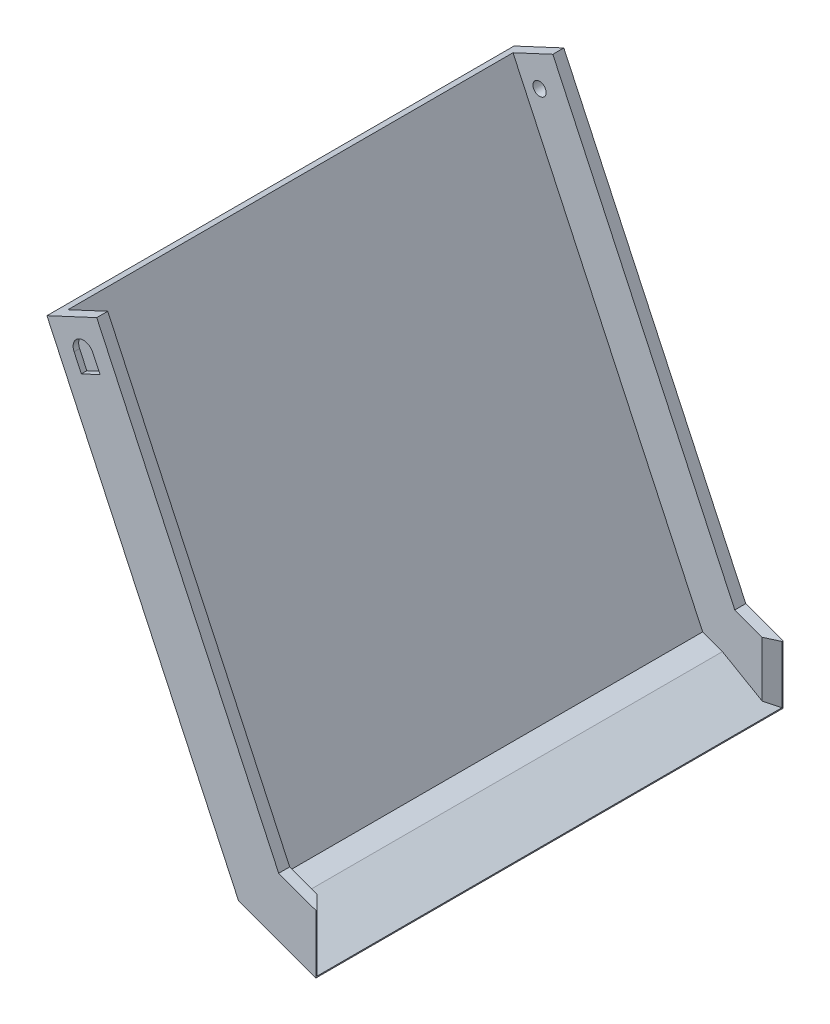
ISO-10303-21;
HEADER;
FILE_DESCRIPTION(('STEP AP214'),'2;1');
FILE_NAME('part.step','',(''),(''),'','','');
FILE_SCHEMA(('AUTOMOTIVE_DESIGN { 1 0 10303 214 1 1 1 1 }'));
ENDSEC;
DATA;
#1=APPLICATION_CONTEXT('core data for automotive mechanical design processes');
#2=APPLICATION_PROTOCOL_DEFINITION('international standard','automotive_design',2000,#1);
#3=PRODUCT_CONTEXT('',#1,'mechanical');
#4=PRODUCT('Part','Part','',(#3));
#5=PRODUCT_RELATED_PRODUCT_CATEGORY('part','',(#4));
#6=PRODUCT_DEFINITION_FORMATION('','',#4);
#7=PRODUCT_DEFINITION_CONTEXT('part definition',#1,'design');
#8=PRODUCT_DEFINITION('design','',#6,#7);
#9=PRODUCT_DEFINITION_SHAPE('','',#8);
#10=(LENGTH_UNIT() NAMED_UNIT(*) SI_UNIT(.MILLI.,.METRE.));
#11=(NAMED_UNIT(*) PLANE_ANGLE_UNIT() SI_UNIT($,.RADIAN.));
#12=(NAMED_UNIT(*) SI_UNIT($,.STERADIAN.) SOLID_ANGLE_UNIT());
#13=UNCERTAINTY_MEASURE_WITH_UNIT(LENGTH_MEASURE(1.E-05),#10,'distance_accuracy_value','');
#14=(GEOMETRIC_REPRESENTATION_CONTEXT(3) GLOBAL_UNCERTAINTY_ASSIGNED_CONTEXT((#13)) GLOBAL_UNIT_ASSIGNED_CONTEXT((#10,
#11,#12)) REPRESENTATION_CONTEXT('',''));
#15=CARTESIAN_POINT('',(0.,0.,0.));
#16=DIRECTION('',(0.,0.,1.));
#17=DIRECTION('',(1.,0.,0.));
#18=AXIS2_PLACEMENT_3D('',#15,#16,#17);
#19=CARTESIAN_POINT('',(0.,0.,170.));
#20=DIRECTION('',(1.,0.,0.));
#21=DIRECTION('',(0.,1.,0.));
#22=AXIS2_PLACEMENT_3D('',#19,#20,#21);
#23=PLANE('',#22);
#24=DIRECTION('',(0.,0.,-1.));
#25=VECTOR('',#24,1.);
#26=CARTESIAN_POINT('',(0.,-20.8835554495183,188.550403328736));
#27=LINE('',#26,#25);
#28=CARTESIAN_POINT('',(0.,-20.8835554495183,169.6));
#29=VERTEX_POINT('',#28);
#30=CARTESIAN_POINT('',(0.,-20.8835554495183,0.399999999999984));
#31=VERTEX_POINT('',#30);
#32=EDGE_CURVE('E179',#29,#31,#27,.T.);
#33=ORIENTED_EDGE('',*,*,#32,.F.);
#34=DIRECTION('',(0.,1.,0.));
#35=VECTOR('',#34,1.);
#36=CARTESIAN_POINT('',(0.,0.,169.6));
#37=LINE('',#36,#35);
#38=CARTESIAN_POINT('',(0.,0.,169.6));
#39=VERTEX_POINT('',#38);
#40=EDGE_CURVE('E281',#29,#39,#37,.T.);
#41=ORIENTED_EDGE('',*,*,#40,.T.);
#42=DIRECTION('',(0.,0.,-1.));
#43=VECTOR('',#42,1.);
#44=CARTESIAN_POINT('',(0.,0.,170.));
#45=LINE('',#44,#43);
#46=CARTESIAN_POINT('',(0.,0.,170.));
#47=VERTEX_POINT('',#46);
#48=EDGE_CURVE('E265',#47,#39,#45,.T.);
#49=ORIENTED_EDGE('',*,*,#48,.F.);
#50=DIRECTION('',(0.,-1.,0.));
#51=VECTOR('',#50,1.);
#52=CARTESIAN_POINT('',(0.,0.,170.));
#53=LINE('',#52,#51);
#54=CARTESIAN_POINT('',(0.,-21.2835554495183,170.));
#55=VERTEX_POINT('',#54);
#56=EDGE_CURVE('E232',#47,#55,#53,.T.);
#57=ORIENTED_EDGE('',*,*,#56,.T.);
#58=DIRECTION('',(0.,0.,-1.));
#59=VECTOR('',#58,1.);
#60=CARTESIAN_POINT('',(0.,-21.2835554495183,170.));
#61=LINE('',#60,#59);
#62=CARTESIAN_POINT('',(0.,-21.2835554495183,0.));
#63=VERTEX_POINT('',#62);
#64=EDGE_CURVE('E263',#55,#63,#61,.T.);
#65=ORIENTED_EDGE('',*,*,#64,.T.);
#66=DIRECTION('',(0.,-1.,0.));
#67=VECTOR('',#66,1.);
#68=CARTESIAN_POINT('',(0.,0.,0.));
#69=LINE('',#68,#67);
#70=CARTESIAN_POINT('',(0.,0.,0.));
#71=VERTEX_POINT('',#70);
#72=EDGE_CURVE('E250',#71,#63,#69,.T.);
#73=ORIENTED_EDGE('',*,*,#72,.F.);
#74=CARTESIAN_POINT('',(0.,0.,0.399999999999984));
#75=VERTEX_POINT('',#74);
#76=EDGE_CURVE('E268',#75,#71,#45,.T.);
#77=ORIENTED_EDGE('',*,*,#76,.F.);
#78=DIRECTION('',(0.,-1.,0.));
#79=VECTOR('',#78,1.);
#80=CARTESIAN_POINT('',(0.,-20.8835554495183,0.399999999999984));
#81=LINE('',#80,#79);
#82=EDGE_CURVE('E278',#75,#31,#81,.T.);
#83=ORIENTED_EDGE('',*,*,#82,.T.);
#84=EDGE_LOOP('',(#33,#41,#49,#57,#65,#73,#77,#83));
#85=FACE_BOUND('',#84,.T.);
#86=ADVANCED_FACE('F43',(#85),#23,.T.);
#87=CARTESIAN_POINT('',(1.36808057330269,-17.5247849663746,170.));
#88=DIRECTION('',(-0.342020143325673,-0.939692620785907,0.));
#89=DIRECTION('',(0.939692620785907,-0.342020143325673,0.));
#90=AXIS2_PLACEMENT_3D('',#87,#88,#89);
#91=PLANE('',#90);
#92=DIRECTION('',(0.,0.,1.));
#93=VECTOR('',#92,1.);
#94=CARTESIAN_POINT('',(-18.0743765052232,-10.4483093087929,170.));
#95=LINE('',#94,#93);
#96=CARTESIAN_POINT('',(-18.0743765052232,-10.4483093087929,4.));
#97=VERTEX_POINT('',#96);
#98=CARTESIAN_POINT('',(-18.0743765052232,-10.4483093087929,166.));
#99=VERTEX_POINT('',#98);
#100=EDGE_CURVE('E176',#97,#99,#95,.T.);
#101=ORIENTED_EDGE('',*,*,#100,.F.);
#102=DIRECTION('',(-0.939692620785907,0.342020143325673,0.));
#103=VECTOR('',#102,1.);
#104=CARTESIAN_POINT('',(-5.47232229321076,-15.0350819325745,4.));
#105=LINE('',#104,#103);
#106=CARTESIAN_POINT('',(-25.2657643383088,-7.8308581944856,4.));
#107=VERTEX_POINT('',#106);
#108=EDGE_CURVE('E184',#97,#107,#105,.T.);
#109=ORIENTED_EDGE('',*,*,#108,.T.);
#110=DIRECTION('',(0.,0.,-1.));
#111=VECTOR('',#110,1.);
#112=CARTESIAN_POINT('',(-25.2657643383087,-7.83085819448561,170.));
#113=LINE('',#112,#111);
#114=CARTESIAN_POINT('',(-25.2657643383088,-7.8308581944856,166.));
#115=VERTEX_POINT('',#114);
#116=EDGE_CURVE('E210',#115,#107,#113,.T.);
#117=ORIENTED_EDGE('',*,*,#116,.F.);
#118=DIRECTION('',(-0.939692620785907,0.342020143325673,0.));
#119=VECTOR('',#118,1.);
#120=CARTESIAN_POINT('',(-5.47232229321076,-15.0350819325745,166.));
#121=LINE('',#120,#119);
#122=EDGE_CURVE('E186',#99,#115,#121,.T.);
#123=ORIENTED_EDGE('',*,*,#122,.F.);
#124=EDGE_LOOP('',(#101,#109,#117,#123));
#125=FACE_BOUND('',#124,.T.);
#126=ADVANCED_FACE('F182',(#125),#91,.F.);
#127=CARTESIAN_POINT('',(0.,0.,170.));
#128=DIRECTION('',(0.,0.,-1.));
#129=DIRECTION('',(-1.,0.,0.));
#130=AXIS2_PLACEMENT_3D('',#127,#128,#129);
#131=PLANE('',#130);
#132=DIRECTION('',(0.906307787036652,0.422618261740695,0.));
#133=VECTOR('',#132,1.);
#134=CARTESIAN_POINT('',(-97.9227918107918,138.5178337113,170.));
#135=LINE('',#134,#133);
#136=CARTESIAN_POINT('',(-97.9227918107918,138.5178337113,170.));
#137=VERTEX_POINT('',#136);
#138=CARTESIAN_POINT('',(-79.7966360700587,146.970198946113,170.));
#139=VERTEX_POINT('',#138);
#140=EDGE_CURVE('E222',#137,#139,#135,.T.);
#141=ORIENTED_EDGE('',*,*,#140,.F.);
#142=DIRECTION('',(-0.422618261740694,0.906307787036652,0.));
#143=VECTOR('',#142,1.);
#144=CARTESIAN_POINT('',(-28.1907786235772,-11.0229511497481,170.));
#145=LINE('',#144,#143);
#146=CARTESIAN_POINT('',(-28.1907786235772,-11.0229511497481,170.));
#147=VERTEX_POINT('',#146);
#148=EDGE_CURVE('E238',#147,#137,#145,.T.);
#149=ORIENTED_EDGE('',*,*,#148,.F.);
#150=DIRECTION('',(-0.939692620785907,0.342020143325673,0.));
#151=VECTOR('',#150,1.);
#152=CARTESIAN_POINT('',(0.,-21.2835554495183,170.));
#153=LINE('',#152,#151);
#154=EDGE_CURVE('E235',#55,#147,#153,.T.);
#155=ORIENTED_EDGE('',*,*,#154,.F.);
#156=ORIENTED_EDGE('',*,*,#56,.F.);
#157=DIRECTION('',(0.939692620785907,-0.342020143325672,0.));
#158=VECTOR('',#157,1.);
#159=CARTESIAN_POINT('',(-13.5657071972349,4.93751362656435,170.));
#160=LINE('',#159,#158);
#161=CARTESIAN_POINT('',(-13.5657071972349,4.93751362656435,170.));
#162=VERTEX_POINT('',#161);
#163=EDGE_CURVE('E229',#162,#47,#160,.T.);
#164=ORIENTED_EDGE('',*,*,#163,.F.);
#165=DIRECTION('',(0.422618261740694,-0.906307787036652,0.));
#166=VECTOR('',#165,1.);
#167=CARTESIAN_POINT('',(-79.7966360700587,146.970198946113,170.));
#168=LINE('',#167,#166);
#169=EDGE_CURVE('E225',#139,#162,#168,.T.);
#170=ORIENTED_EDGE('',*,*,#169,.F.);
#171=EDGE_LOOP('',(#141,#149,#155,#156,#164,#170));
#172=FACE_BOUND('',#171,.T.);
#173=DIRECTION('',(0.42261826174069,-0.906307787036654,0.));
#174=VECTOR('',#173,1.);
#175=CARTESIAN_POINT('',(-81.2348771216308,135.265756939868,170.));
#176=LINE('',#175,#174);
#177=CARTESIAN_POINT('',(-81.2348771216308,135.265756939868,170.));
#178=VERTEX_POINT('',#177);
#179=CARTESIAN_POINT('',(-78.5935129857515,129.601333270889,170.));
#180=VERTEX_POINT('',#179);
#181=EDGE_CURVE('E187',#178,#180,#176,.T.);
#182=ORIENTED_EDGE('',*,*,#181,.T.);
#183=DIRECTION('',(-0.906307787036652,-0.422618261740694,0.));
#184=VECTOR('',#183,1.);
#185=CARTESIAN_POINT('',(-78.5935129857515,129.601333270889,170.));
#186=LINE('',#185,#184);
#187=CARTESIAN_POINT('',(-85.3908213885264,126.431696307833,170.));
#188=VERTEX_POINT('',#187);
#189=EDGE_CURVE('E403',#180,#188,#186,.T.);
#190=ORIENTED_EDGE('',*,*,#189,.T.);
#191=DIRECTION('',(-0.422618261740697,0.906307787036651,0.));
#192=VECTOR('',#191,1.);
#193=CARTESIAN_POINT('',(-85.3908213885264,126.431696307833,170.));
#194=LINE('',#193,#192);
#195=CARTESIAN_POINT('',(-88.0321855244058,132.096119976812,170.));
#196=VERTEX_POINT('',#195);
#197=EDGE_CURVE('E400',#188,#196,#194,.T.);
#198=ORIENTED_EDGE('',*,*,#197,.T.);
#199=CARTESIAN_POINT('',(-84.6335313230183,133.68093845834,170.));
#200=DIRECTION('',(0.,0.,1.));
#201=DIRECTION('',(1.,0.,0.));
#202=AXIS2_PLACEMENT_3D('',#199,#200,#201);
#203=CIRCLE('',#202,3.75000000000004);
#204=EDGE_CURVE('E396',#178,#196,#203,.T.);
#205=ORIENTED_EDGE('',*,*,#204,.F.);
#206=EDGE_LOOP('',(#182,#190,#198,#205));
#207=FACE_BOUND('',#206,.T.);
#208=ADVANCED_FACE('F303',(#172,#207),#131,.F.);
#209=CARTESIAN_POINT('',(-97.9227918107918,138.5178337113,170.));
#210=DIRECTION('',(-0.422618261740695,0.906307787036652,0.));
#211=DIRECTION('',(-0.906307787036652,-0.422618261740695,0.));
#212=AXIS2_PLACEMENT_3D('',#209,#210,#211);
#213=PLANE('',#212);
#214=DIRECTION('',(0.,0.,-1.));
#215=VECTOR('',#214,1.);
#216=CARTESIAN_POINT('',(-94.2975606626452,140.208306758262,170.));
#217=LINE('',#216,#215);
#218=CARTESIAN_POINT('',(-94.2975606626452,140.208306758262,166.));
#219=VERTEX_POINT('',#218);
#220=CARTESIAN_POINT('',(-94.2975606626452,140.208306758262,4.));
#221=VERTEX_POINT('',#220);
#222=EDGE_CURVE('E206',#219,#221,#217,.T.);
#223=ORIENTED_EDGE('',*,*,#222,.T.);
#224=DIRECTION('',(0.906307787036652,0.422618261740695,0.));
#225=VECTOR('',#224,1.);
#226=CARTESIAN_POINT('',(-70.5450256581592,151.284295731449,4.));
#227=LINE('',#226,#225);
#228=CARTESIAN_POINT('',(-79.7966360700587,146.970198946113,4.));
#229=VERTEX_POINT('',#228);
#230=EDGE_CURVE('E218',#221,#229,#227,.T.);
#231=ORIENTED_EDGE('',*,*,#230,.T.);
#232=DIRECTION('',(0.,0.,-1.));
#233=VECTOR('',#232,1.);
#234=CARTESIAN_POINT('',(-79.7966360700587,146.970198946113,170.));
#235=LINE('',#234,#233);
#236=CARTESIAN_POINT('',(-79.7966360700587,146.970198946113,0.));
#237=VERTEX_POINT('',#236);
#238=EDGE_CURVE('E241',#229,#237,#235,.T.);
#239=ORIENTED_EDGE('',*,*,#238,.T.);
#240=DIRECTION('',(0.906307787036652,0.422618261740695,0.));
#241=VECTOR('',#240,1.);
#242=CARTESIAN_POINT('',(-97.9227918107918,138.5178337113,0.));
#243=LINE('',#242,#241);
#244=CARTESIAN_POINT('',(-97.9227918107918,138.5178337113,0.));
#245=VERTEX_POINT('',#244);
#246=EDGE_CURVE('E209',#245,#237,#243,.T.);
#247=ORIENTED_EDGE('',*,*,#246,.F.);
#248=DIRECTION('',(0.,0.,-1.));
#249=VECTOR('',#248,1.);
#250=CARTESIAN_POINT('',(-97.9227918107918,138.5178337113,170.));
#251=LINE('',#250,#249);
#252=EDGE_CURVE('E258',#137,#245,#251,.T.);
#253=ORIENTED_EDGE('',*,*,#252,.F.);
#254=ORIENTED_EDGE('',*,*,#140,.T.);
#255=CARTESIAN_POINT('',(-79.7966360700587,146.970198946113,166.));
#256=VERTEX_POINT('',#255);
#257=EDGE_CURVE('E273',#139,#256,#235,.T.);
#258=ORIENTED_EDGE('',*,*,#257,.T.);
#259=DIRECTION('',(0.906307787036652,0.422618261740695,0.));
#260=VECTOR('',#259,1.);
#261=CARTESIAN_POINT('',(-70.5450256581592,151.284295731449,166.));
#262=LINE('',#261,#260);
#263=EDGE_CURVE('E196',#219,#256,#262,.T.);
#264=ORIENTED_EDGE('',*,*,#263,.F.);
#265=EDGE_LOOP('',(#223,#231,#239,#247,#253,#254,#258,#264));
#266=FACE_BOUND('',#265,.T.);
#267=ADVANCED_FACE('F311',(#266),#213,.T.);
#268=CARTESIAN_POINT('',(-13.5657071972349,4.93751362656435,170.));
#269=DIRECTION('',(0.342020143325672,0.939692620785907,0.));
#270=DIRECTION('',(-0.939692620785907,0.342020143325672,0.));
#271=AXIS2_PLACEMENT_3D('',#268,#269,#270);
#272=PLANE('',#271);
#273=DIRECTION('',(0.939692620785907,-0.342020143325672,0.));
#274=VECTOR('',#273,1.);
#275=CARTESIAN_POINT('',(0.,0.,4.));
#276=LINE('',#275,#274);
#277=CARTESIAN_POINT('',(-13.5657071972349,4.93751362656435,4.));
#278=VERTEX_POINT('',#277);
#279=CARTESIAN_POINT('',(-3.60000000000002,1.31029284335835,4.));
#280=VERTEX_POINT('',#279);
#281=EDGE_CURVE('E194',#278,#280,#276,.T.);
#282=ORIENTED_EDGE('',*,*,#281,.T.);
#283=DIRECTION('',(0.684791078771736,-0.249243569363957,-0.684791078771735));
#284=VECTOR('',#283,1.);
#285=CARTESIAN_POINT('',(-86.7362445879475,31.5694112620463,87.1362445879474));
#286=LINE('',#285,#284);
#287=EDGE_CURVE('E286',#280,#75,#286,.T.);
#288=ORIENTED_EDGE('',*,*,#287,.T.);
#289=ORIENTED_EDGE('',*,*,#76,.T.);
#290=DIRECTION('',(0.939692620785907,-0.342020143325672,0.));
#291=VECTOR('',#290,1.);
#292=CARTESIAN_POINT('',(-13.5657071972349,4.93751362656435,0.));
#293=LINE('',#292,#291);
#294=CARTESIAN_POINT('',(-13.5657071972349,4.93751362656435,0.));
#295=VERTEX_POINT('',#294);
#296=EDGE_CURVE('E247',#295,#71,#293,.T.);
#297=ORIENTED_EDGE('',*,*,#296,.F.);
#298=DIRECTION('',(0.,0.,-1.));
#299=VECTOR('',#298,1.);
#300=CARTESIAN_POINT('',(-13.5657071972349,4.93751362656435,170.));
#301=LINE('',#300,#299);
#302=EDGE_CURVE('E272',#278,#295,#301,.T.);
#303=ORIENTED_EDGE('',*,*,#302,.F.);
#304=EDGE_LOOP('',(#282,#288,#289,#297,#303));
#305=FACE_BOUND('',#304,.T.);
#306=ADVANCED_FACE('F328',(#305),#272,.T.);
#307=CARTESIAN_POINT('',(-79.7966360700587,146.970198946113,170.));
#308=DIRECTION('',(0.906307787036652,0.422618261740694,0.));
#309=DIRECTION('',(-0.422618261740695,0.906307787036652,0.));
#310=AXIS2_PLACEMENT_3D('',#307,#308,#309);
#311=PLANE('',#310);
#312=ORIENTED_EDGE('',*,*,#238,.F.);
#313=DIRECTION('',(0.422618261740695,-0.906307787036652,0.));
#314=VECTOR('',#313,1.);
#315=CARTESIAN_POINT('',(-9.25161041189965,-4.31409678533526,4.));
#316=LINE('',#315,#314);
#317=EDGE_CURVE('E198',#229,#278,#316,.T.);
#318=ORIENTED_EDGE('',*,*,#317,.T.);
#319=ORIENTED_EDGE('',*,*,#302,.T.);
#320=DIRECTION('',(0.422618261740694,-0.906307787036652,0.));
#321=VECTOR('',#320,1.);
#322=CARTESIAN_POINT('',(-79.7966360700587,146.970198946113,0.));
#323=LINE('',#322,#321);
#324=EDGE_CURVE('E244',#237,#295,#323,.T.);
#325=ORIENTED_EDGE('',*,*,#324,.F.);
#326=EDGE_LOOP('',(#312,#318,#319,#325));
#327=FACE_BOUND('',#326,.T.);
#328=ADVANCED_FACE('F353',(#327),#311,.T.);
#329=CARTESIAN_POINT('',(-28.1907786235772,-11.0229511497481,170.));
#330=DIRECTION('',(-0.906307787036652,-0.422618261740694,0.));
#331=DIRECTION('',(0.422618261740694,-0.906307787036652,0.));
#332=AXIS2_PLACEMENT_3D('',#329,#330,#331);
#333=PLANE('',#332);
#334=DIRECTION('',(-0.422618261740694,0.906307787036652,0.));
#335=VECTOR('',#334,1.);
#336=CARTESIAN_POINT('',(-28.1907786235772,-11.0229511497481,0.));
#337=LINE('',#336,#335);
#338=CARTESIAN_POINT('',(-28.1907786235772,-11.0229511497481,0.));
#339=VERTEX_POINT('',#338);
#340=EDGE_CURVE('E226',#339,#245,#337,.T.);
#341=ORIENTED_EDGE('',*,*,#340,.F.);
#342=DIRECTION('',(0.,0.,-1.));
#343=VECTOR('',#342,1.);
#344=CARTESIAN_POINT('',(-28.1907786235772,-11.0229511497481,170.));
#345=LINE('',#344,#343);
#346=EDGE_CURVE('E261',#147,#339,#345,.T.);
#347=ORIENTED_EDGE('',*,*,#346,.F.);
#348=ORIENTED_EDGE('',*,*,#148,.T.);
#349=ORIENTED_EDGE('',*,*,#252,.T.);
#350=EDGE_LOOP('',(#341,#347,#348,#349));
#351=FACE_BOUND('',#350,.T.);
#352=ADVANCED_FACE('F316',(#351),#333,.T.);
#353=CARTESIAN_POINT('',(0.,-21.2835554495183,170.));
#354=DIRECTION('',(-0.342020143325673,-0.939692620785907,0.));
#355=DIRECTION('',(0.939692620785907,-0.342020143325673,0.));
#356=AXIS2_PLACEMENT_3D('',#353,#354,#355);
#357=PLANE('',#356);
#358=DIRECTION('',(-0.939692620785907,0.342020143325673,0.));
#359=VECTOR('',#358,1.);
#360=CARTESIAN_POINT('',(0.,-21.2835554495183,0.));
#361=LINE('',#360,#359);
#362=EDGE_CURVE('E253',#63,#339,#361,.T.);
#363=ORIENTED_EDGE('',*,*,#362,.F.);
#364=ORIENTED_EDGE('',*,*,#64,.F.);
#365=ORIENTED_EDGE('',*,*,#154,.T.);
#366=ORIENTED_EDGE('',*,*,#346,.T.);
#367=EDGE_LOOP('',(#363,#364,#365,#366));
#368=FACE_BOUND('',#367,.T.);
#369=ADVANCED_FACE('F319',(#368),#357,.T.);
#370=ORIENTED_EDGE('',*,*,#48,.T.);
#371=DIRECTION('',(0.684791078771733,-0.249243569363956,0.684791078771738));
#372=VECTOR('',#371,1.);
#373=CARTESIAN_POINT('',(-7.01664492183669,2.55384989596369,162.583355078163));
#374=LINE('',#373,#372);
#375=CARTESIAN_POINT('',(-3.59999999999999,1.31029284335834,166.));
#376=VERTEX_POINT('',#375);
#377=EDGE_CURVE('E283',#39,#376,#374,.F.);
#378=ORIENTED_EDGE('',*,*,#377,.T.);
#379=DIRECTION('',(0.939692620785907,-0.342020143325672,0.));
#380=VECTOR('',#379,1.);
#381=CARTESIAN_POINT('',(0.,0.,166.));
#382=LINE('',#381,#380);
#383=CARTESIAN_POINT('',(-13.5657071972349,4.93751362656435,166.));
#384=VERTEX_POINT('',#383);
#385=EDGE_CURVE('E205',#384,#376,#382,.T.);
#386=ORIENTED_EDGE('',*,*,#385,.F.);
#387=EDGE_CURVE('E269',#162,#384,#301,.T.);
#388=ORIENTED_EDGE('',*,*,#387,.F.);
#389=ORIENTED_EDGE('',*,*,#163,.T.);
#390=EDGE_LOOP('',(#370,#378,#386,#388,#389));
#391=FACE_BOUND('',#390,.T.);
#392=ADVANCED_FACE('F297',(#391),#272,.T.);
#393=DIRECTION('',(0.422618261740695,-0.906307787036652,0.));
#394=VECTOR('',#393,1.);
#395=CARTESIAN_POINT('',(-9.25161041189965,-4.31409678533526,166.));
#396=LINE('',#395,#394);
#397=EDGE_CURVE('E212',#256,#384,#396,.T.);
#398=ORIENTED_EDGE('',*,*,#397,.F.);
#399=ORIENTED_EDGE('',*,*,#257,.F.);
#400=ORIENTED_EDGE('',*,*,#169,.T.);
#401=ORIENTED_EDGE('',*,*,#387,.T.);
#402=EDGE_LOOP('',(#398,#399,#400,#401));
#403=FACE_BOUND('',#402,.T.);
#404=ADVANCED_FACE('F308',(#403),#311,.T.);
#405=CARTESIAN_POINT('',(0.,0.,0.));
#406=DIRECTION('',(0.,0.,-1.));
#407=DIRECTION('',(-1.,0.,0.));
#408=AXIS2_PLACEMENT_3D('',#405,#406,#407);
#409=PLANE('',#408);
#410=CARTESIAN_POINT('',(-84.6335313230183,133.68093845834,0.));
#411=DIRECTION('',(0.,0.,-1.));
#412=DIRECTION('',(-1.,0.,0.));
#413=AXIS2_PLACEMENT_3D('',#410,#411,#412);
#414=CIRCLE('',#413,2.4);
#415=CARTESIAN_POINT('',(-87.0335313230183,133.68093845834,0.));
#416=VERTEX_POINT('',#415);
#417=EDGE_CURVE('E418',#416,#416,#414,.T.);
#418=ORIENTED_EDGE('',*,*,#417,.F.);
#419=EDGE_LOOP('',(#418));
#420=FACE_BOUND('',#419,.T.);
#421=ORIENTED_EDGE('',*,*,#246,.T.);
#422=ORIENTED_EDGE('',*,*,#324,.T.);
#423=ORIENTED_EDGE('',*,*,#296,.T.);
#424=ORIENTED_EDGE('',*,*,#72,.T.);
#425=ORIENTED_EDGE('',*,*,#362,.T.);
#426=ORIENTED_EDGE('',*,*,#340,.T.);
#427=EDGE_LOOP('',(#421,#422,#423,#424,#425,#426));
#428=FACE_BOUND('',#427,.T.);
#429=ADVANCED_FACE('F323',(#420,#428),#409,.T.);
#430=CARTESIAN_POINT('',(-24.5655474754306,-9.33247810278532,170.));
#431=DIRECTION('',(-0.906307787036652,-0.422618261740694,0.));
#432=DIRECTION('',(0.422618261740694,-0.906307787036652,0.));
#433=AXIS2_PLACEMENT_3D('',#430,#431,#432);
#434=PLANE('',#433);
#435=DIRECTION('',(-0.422618261740694,0.906307787036652,0.));
#436=VECTOR('',#435,1.);
#437=CARTESIAN_POINT('',(-23.7525350044861,-11.0759889731864,4.));
#438=LINE('',#437,#436);
#439=EDGE_CURVE('E193',#107,#221,#438,.T.);
#440=ORIENTED_EDGE('',*,*,#439,.T.);
#441=ORIENTED_EDGE('',*,*,#222,.F.);
#442=DIRECTION('',(-0.422618261740694,0.906307787036652,0.));
#443=VECTOR('',#442,1.);
#444=CARTESIAN_POINT('',(-23.7525350044861,-11.0759889731864,166.));
#445=LINE('',#444,#443);
#446=EDGE_CURVE('E202',#115,#219,#445,.T.);
#447=ORIENTED_EDGE('',*,*,#446,.F.);
#448=ORIENTED_EDGE('',*,*,#116,.T.);
#449=EDGE_LOOP('',(#440,#441,#447,#448));
#450=FACE_BOUND('',#449,.T.);
#451=ADVANCED_FACE('F371',(#450),#434,.F.);
#452=CARTESIAN_POINT('',(0.,0.,166.));
#453=DIRECTION('',(0.,0.,-1.));
#454=DIRECTION('',(-1.,0.,0.));
#455=AXIS2_PLACEMENT_3D('',#452,#453,#454);
#456=PLANE('',#455);
#457=ORIENTED_EDGE('',*,*,#385,.T.);
#458=DIRECTION('',(0.,-1.,0.));
#459=VECTOR('',#458,1.);
#460=CARTESIAN_POINT('',(-3.59999999999999,0.,166.));
#461=LINE('',#460,#459);
#462=CARTESIAN_POINT('',(-3.59999999999999,-18.8050944804356,166.));
#463=VERTEX_POINT('',#462);
#464=EDGE_CURVE('E260',#376,#463,#461,.T.);
#465=ORIENTED_EDGE('',*,*,#464,.T.);
#466=DIRECTION('',(-0.866025403784436,0.500000000000004,0.));
#467=VECTOR('',#466,1.);
#468=CARTESIAN_POINT('',(0.,-20.8835554495183,166.));
#469=LINE('',#468,#467);
#470=EDGE_CURVE('E188',#463,#99,#469,.T.);
#471=ORIENTED_EDGE('',*,*,#470,.T.);
#472=ORIENTED_EDGE('',*,*,#122,.T.);
#473=ORIENTED_EDGE('',*,*,#446,.T.);
#474=ORIENTED_EDGE('',*,*,#263,.T.);
#475=ORIENTED_EDGE('',*,*,#397,.T.);
#476=EDGE_LOOP('',(#457,#465,#471,#472,#473,#474,#475));
#477=FACE_BOUND('',#476,.T.);
#478=ADVANCED_FACE('F427',(#477),#456,.T.);
#479=CARTESIAN_POINT('',(0.,0.,4.));
#480=DIRECTION('',(0.,0.,-1.));
#481=DIRECTION('',(-1.,0.,0.));
#482=AXIS2_PLACEMENT_3D('',#479,#480,#481);
#483=PLANE('',#482);
#484=CARTESIAN_POINT('',(-84.6335313230183,133.68093845834,4.));
#485=DIRECTION('',(0.,0.,-1.));
#486=DIRECTION('',(-1.,0.,0.));
#487=AXIS2_PLACEMENT_3D('',#484,#485,#486);
#488=CIRCLE('',#487,2.4);
#489=CARTESIAN_POINT('',(-87.0335313230183,133.68093845834,4.));
#490=VERTEX_POINT('',#489);
#491=EDGE_CURVE('E48',#490,#490,#488,.T.);
#492=ORIENTED_EDGE('',*,*,#491,.T.);
#493=EDGE_LOOP('',(#492));
#494=FACE_BOUND('',#493,.T.);
#495=DIRECTION('',(0.866025403784436,-0.500000000000004,0.));
#496=VECTOR('',#495,1.);
#497=CARTESIAN_POINT('',(0.,-20.8835554495183,4.));
#498=LINE('',#497,#496);
#499=CARTESIAN_POINT('',(-3.60000000000002,-18.8050944804356,4.));
#500=VERTEX_POINT('',#499);
#501=EDGE_CURVE('E172',#97,#500,#498,.T.);
#502=ORIENTED_EDGE('',*,*,#501,.T.);
#503=DIRECTION('',(0.,1.,0.));
#504=VECTOR('',#503,1.);
#505=CARTESIAN_POINT('',(-3.60000000000002,0.,4.));
#506=LINE('',#505,#504);
#507=EDGE_CURVE('E60',#500,#280,#506,.T.);
#508=ORIENTED_EDGE('',*,*,#507,.T.);
#509=ORIENTED_EDGE('',*,*,#281,.F.);
#510=ORIENTED_EDGE('',*,*,#317,.F.);
#511=ORIENTED_EDGE('',*,*,#230,.F.);
#512=ORIENTED_EDGE('',*,*,#439,.F.);
#513=ORIENTED_EDGE('',*,*,#108,.F.);
#514=EDGE_LOOP('',(#502,#508,#509,#510,#511,#512,#513));
#515=FACE_BOUND('',#514,.T.);
#516=ADVANCED_FACE('F191',(#494,#515),#483,.F.);
#517=CARTESIAN_POINT('',(-81.2348771216308,135.265756939868,168.));
#518=DIRECTION('',(-0.906307787036654,-0.42261826174069,0.));
#519=DIRECTION('',(0.42261826174069,-0.906307787036654,0.));
#520=AXIS2_PLACEMENT_3D('',#517,#518,#519);
#521=PLANE('',#520);
#522=ORIENTED_EDGE('',*,*,#181,.F.);
#523=DIRECTION('',(0.,0.,1.));
#524=VECTOR('',#523,1.);
#525=CARTESIAN_POINT('',(-81.2348771216308,135.265756939868,168.));
#526=LINE('',#525,#524);
#527=CARTESIAN_POINT('',(-81.2348771216308,135.265756939868,168.));
#528=VERTEX_POINT('',#527);
#529=EDGE_CURVE('E392',#528,#178,#526,.T.);
#530=ORIENTED_EDGE('',*,*,#529,.F.);
#531=DIRECTION('',(0.42261826174069,-0.906307787036654,0.));
#532=VECTOR('',#531,1.);
#533=CARTESIAN_POINT('',(-81.2348771216308,135.265756939868,168.));
#534=LINE('',#533,#532);
#535=CARTESIAN_POINT('',(-78.5935129857515,129.601333270889,168.));
#536=VERTEX_POINT('',#535);
#537=EDGE_CURVE('E399',#528,#536,#534,.T.);
#538=ORIENTED_EDGE('',*,*,#537,.T.);
#539=DIRECTION('',(0.,0.,1.));
#540=VECTOR('',#539,1.);
#541=CARTESIAN_POINT('',(-78.5935129857515,129.601333270889,168.));
#542=LINE('',#541,#540);
#543=EDGE_CURVE('E221',#536,#180,#542,.T.);
#544=ORIENTED_EDGE('',*,*,#543,.T.);
#545=EDGE_LOOP('',(#522,#530,#538,#544));
#546=FACE_BOUND('',#545,.T.);
#547=ADVANCED_FACE('F426',(#546),#521,.T.);
#548=CARTESIAN_POINT('',(-78.5935129857515,129.601333270889,168.));
#549=DIRECTION('',(-0.422618261740694,0.906307787036652,0.));
#550=DIRECTION('',(-0.906307787036652,-0.422618261740694,0.));
#551=AXIS2_PLACEMENT_3D('',#548,#549,#550);
#552=PLANE('',#551);
#553=ORIENTED_EDGE('',*,*,#189,.F.);
#554=ORIENTED_EDGE('',*,*,#543,.F.);
#555=DIRECTION('',(-0.906307787036652,-0.422618261740694,0.));
#556=VECTOR('',#555,1.);
#557=CARTESIAN_POINT('',(-78.5935129857515,129.601333270889,168.));
#558=LINE('',#557,#556);
#559=CARTESIAN_POINT('',(-85.3908213885264,126.431696307833,168.));
#560=VERTEX_POINT('',#559);
#561=EDGE_CURVE('E412',#536,#560,#558,.T.);
#562=ORIENTED_EDGE('',*,*,#561,.T.);
#563=DIRECTION('',(0.,0.,1.));
#564=VECTOR('',#563,1.);
#565=CARTESIAN_POINT('',(-85.3908213885264,126.431696307833,168.));
#566=LINE('',#565,#564);
#567=EDGE_CURVE('E388',#560,#188,#566,.T.);
#568=ORIENTED_EDGE('',*,*,#567,.T.);
#569=EDGE_LOOP('',(#553,#554,#562,#568));
#570=FACE_BOUND('',#569,.T.);
#571=ADVANCED_FACE('F433',(#570),#552,.T.);
#572=CARTESIAN_POINT('',(-85.3908213885264,126.431696307833,168.));
#573=DIRECTION('',(0.906307787036651,0.422618261740697,0.));
#574=DIRECTION('',(-0.422618261740697,0.906307787036651,0.));
#575=AXIS2_PLACEMENT_3D('',#572,#573,#574);
#576=PLANE('',#575);
#577=ORIENTED_EDGE('',*,*,#197,.F.);
#578=ORIENTED_EDGE('',*,*,#567,.F.);
#579=DIRECTION('',(-0.422618261740697,0.906307787036651,0.));
#580=VECTOR('',#579,1.);
#581=CARTESIAN_POINT('',(-85.3908213885264,126.431696307833,168.));
#582=LINE('',#581,#580);
#583=CARTESIAN_POINT('',(-88.0321855244058,132.096119976812,168.));
#584=VERTEX_POINT('',#583);
#585=EDGE_CURVE('E410',#560,#584,#582,.T.);
#586=ORIENTED_EDGE('',*,*,#585,.T.);
#587=DIRECTION('',(0.,0.,1.));
#588=VECTOR('',#587,1.);
#589=CARTESIAN_POINT('',(-88.0321855244058,132.096119976812,168.));
#590=LINE('',#589,#588);
#591=EDGE_CURVE('E390',#584,#196,#590,.T.);
#592=ORIENTED_EDGE('',*,*,#591,.T.);
#593=EDGE_LOOP('',(#577,#578,#586,#592));
#594=FACE_BOUND('',#593,.T.);
#595=ADVANCED_FACE('F445',(#594),#576,.T.);
#596=CARTESIAN_POINT('',(-84.6335313230183,133.68093845834,168.));
#597=DIRECTION('',(0.,0.,1.));
#598=DIRECTION('',(1.,0.,0.));
#599=AXIS2_PLACEMENT_3D('',#596,#597,#598);
#600=CYLINDRICAL_SURFACE('',#599,3.75000000000004);
#601=ORIENTED_EDGE('',*,*,#204,.T.);
#602=ORIENTED_EDGE('',*,*,#591,.F.);
#603=CARTESIAN_POINT('',(-84.6335313230183,133.68093845834,168.));
#604=DIRECTION('',(0.,0.,1.));
#605=DIRECTION('',(1.,0.,0.));
#606=AXIS2_PLACEMENT_3D('',#603,#604,#605);
#607=CIRCLE('',#606,3.75000000000004);
#608=EDGE_CURVE('E395',#528,#584,#607,.T.);
#609=ORIENTED_EDGE('',*,*,#608,.F.);
#610=ORIENTED_EDGE('',*,*,#529,.T.);
#611=EDGE_LOOP('',(#601,#602,#609,#610));
#612=FACE_BOUND('',#611,.T.);
#613=ADVANCED_FACE('F449',(#612),#600,.F.);
#614=CARTESIAN_POINT('',(-84.6335313230183,133.68093845834,168.));
#615=DIRECTION('',(0.,0.,1.));
#616=DIRECTION('',(1.,0.,0.));
#617=AXIS2_PLACEMENT_3D('',#614,#615,#616);
#618=PLANE('',#617);
#619=ORIENTED_EDGE('',*,*,#537,.F.);
#620=ORIENTED_EDGE('',*,*,#608,.T.);
#621=ORIENTED_EDGE('',*,*,#585,.F.);
#622=ORIENTED_EDGE('',*,*,#561,.F.);
#623=EDGE_LOOP('',(#619,#620,#621,#622));
#624=FACE_BOUND('',#623,.T.);
#625=ADVANCED_FACE('F453',(#624),#618,.T.);
#626=CARTESIAN_POINT('',(0.,-20.8835554495183,188.550403328736));
#627=DIRECTION('',(0.500000000000004,0.866025403784436,0.));
#628=DIRECTION('',(-0.866025403784436,0.500000000000004,0.));
#629=AXIS2_PLACEMENT_3D('',#626,#627,#628);
#630=PLANE('',#629);
#631=ORIENTED_EDGE('',*,*,#100,.T.);
#632=ORIENTED_EDGE('',*,*,#470,.F.);
#633=DIRECTION('',(-0.654653670707974,0.377964473009229,-0.654653670707979));
#634=VECTOR('',#633,1.);
#635=CARTESIAN_POINT('',(-8.25305415446393,-16.1186524118019,161.346945845536));
#636=LINE('',#635,#634);
#637=EDGE_CURVE('E53',#463,#29,#636,.F.);
#638=ORIENTED_EDGE('',*,*,#637,.T.);
#639=ORIENTED_EDGE('',*,*,#32,.T.);
#640=DIRECTION('',(-0.654653670707976,0.377964473009231,0.654653670707976));
#641=VECTOR('',#640,1.);
#642=CARTESIAN_POINT('',(-5.16733986874969,-17.9001903853013,5.56733986874967));
#643=LINE('',#642,#641);
#644=EDGE_CURVE('E11',#31,#500,#643,.T.);
#645=ORIENTED_EDGE('',*,*,#644,.T.);
#646=ORIENTED_EDGE('',*,*,#501,.F.);
#647=EDGE_LOOP('',(#631,#632,#638,#639,#645,#646));
#648=FACE_BOUND('',#647,.T.);
#649=ADVANCED_FACE('F174',(#648),#630,.T.);
#650=CARTESIAN_POINT('',(-3.59999999999999,0.,166.));
#651=DIRECTION('',(-0.70710678118655,0.,0.707106781186545));
#652=DIRECTION('',(0.,-1.,0.));
#653=AXIS2_PLACEMENT_3D('',#650,#651,#652);
#654=PLANE('',#653);
#655=ORIENTED_EDGE('',*,*,#377,.F.);
#656=ORIENTED_EDGE('',*,*,#40,.F.);
#657=ORIENTED_EDGE('',*,*,#637,.F.);
#658=ORIENTED_EDGE('',*,*,#464,.F.);
#659=EDGE_LOOP('',(#655,#656,#657,#658));
#660=FACE_BOUND('',#659,.T.);
#661=ADVANCED_FACE('F293',(#660),#654,.F.);
#662=CARTESIAN_POINT('',(0.,0.,0.399999999999984));
#663=DIRECTION('',(0.707106781186547,0.,0.707106781186548));
#664=DIRECTION('',(0.,1.,0.));
#665=AXIS2_PLACEMENT_3D('',#662,#663,#664);
#666=PLANE('',#665);
#667=ORIENTED_EDGE('',*,*,#287,.F.);
#668=ORIENTED_EDGE('',*,*,#507,.F.);
#669=ORIENTED_EDGE('',*,*,#644,.F.);
#670=ORIENTED_EDGE('',*,*,#82,.F.);
#671=EDGE_LOOP('',(#667,#668,#669,#670));
#672=FACE_BOUND('',#671,.T.);
#673=ADVANCED_FACE('F46',(#672),#666,.T.);
#674=CARTESIAN_POINT('',(-84.6335313230183,133.68093845834,10.));
#675=DIRECTION('',(0.,0.,-1.));
#676=DIRECTION('',(-1.,0.,0.));
#677=AXIS2_PLACEMENT_3D('',#674,#675,#676);
#678=CYLINDRICAL_SURFACE('',#677,2.4);
#679=ORIENTED_EDGE('',*,*,#417,.T.);
#680=EDGE_LOOP('',(#679));
#681=FACE_BOUND('',#680,.T.);
#682=ORIENTED_EDGE('',*,*,#491,.F.);
#683=EDGE_LOOP('',(#682));
#684=FACE_BOUND('',#683,.T.);
#685=ADVANCED_FACE('F333',(#681,#684),#678,.F.);
#686=CLOSED_SHELL('',(#86,#126,#208,#267,#306,#328,#352,#369,#392,#404,#429,#451,#478,#516,#547,
#571,#595,#613,#625,#649,#661,#673,#685));
#687=MANIFOLD_SOLID_BREP('B2',#686);
#688=ADVANCED_BREP_SHAPE_REPRESENTATION('',(#18,#687),#14);
#689=SHAPE_DEFINITION_REPRESENTATION(#9,#688);
ENDSEC;
END-ISO-10303-21;
